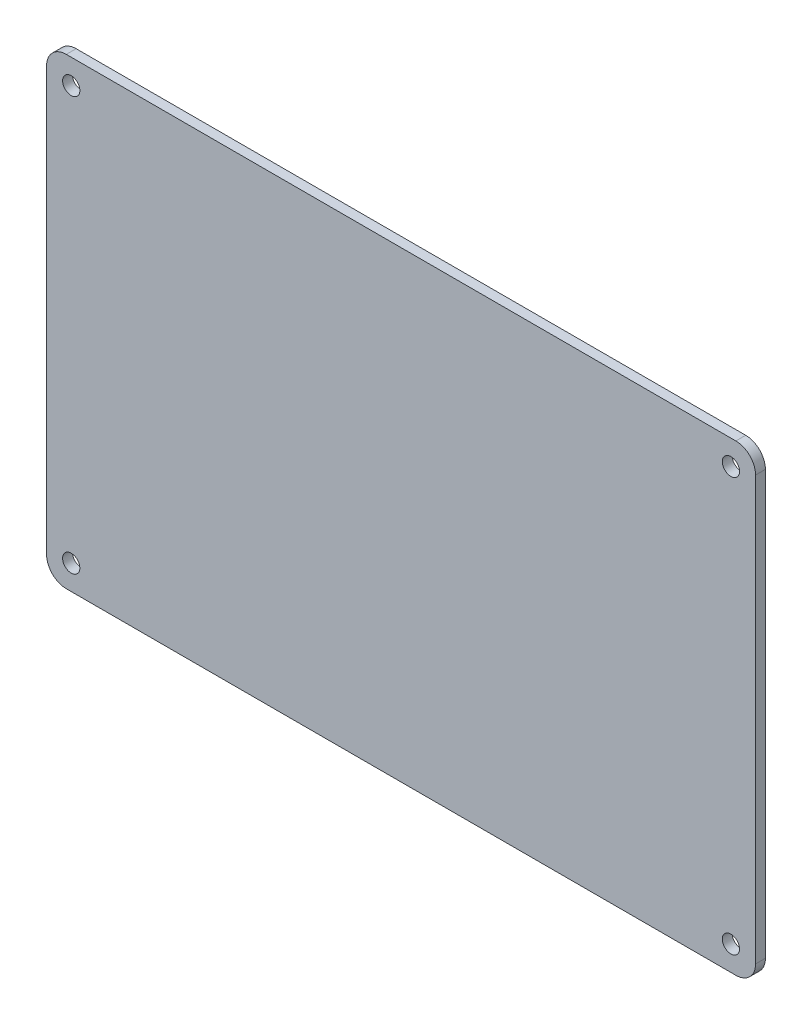
ISO-10303-21;
HEADER;
FILE_DESCRIPTION(('STEP AP214'),'2;1');
FILE_NAME('part.step','',(''),(''),'','','');
FILE_SCHEMA(('AUTOMOTIVE_DESIGN { 1 0 10303 214 1 1 1 1 }'));
ENDSEC;
DATA;
#1=APPLICATION_CONTEXT('core data for automotive mechanical design processes');
#2=APPLICATION_PROTOCOL_DEFINITION('international standard','automotive_design',2000,#1);
#3=PRODUCT_CONTEXT('',#1,'mechanical');
#4=PRODUCT('Part','Part','',(#3));
#5=PRODUCT_RELATED_PRODUCT_CATEGORY('part','',(#4));
#6=PRODUCT_DEFINITION_FORMATION('','',#4);
#7=PRODUCT_DEFINITION_CONTEXT('part definition',#1,'design');
#8=PRODUCT_DEFINITION('design','',#6,#7);
#9=PRODUCT_DEFINITION_SHAPE('','',#8);
#10=(LENGTH_UNIT() NAMED_UNIT(*) SI_UNIT(.MILLI.,.METRE.));
#11=(NAMED_UNIT(*) PLANE_ANGLE_UNIT() SI_UNIT($,.RADIAN.));
#12=(NAMED_UNIT(*) SI_UNIT($,.STERADIAN.) SOLID_ANGLE_UNIT());
#13=UNCERTAINTY_MEASURE_WITH_UNIT(LENGTH_MEASURE(1.E-05),#10,'distance_accuracy_value','');
#14=(GEOMETRIC_REPRESENTATION_CONTEXT(3) GLOBAL_UNCERTAINTY_ASSIGNED_CONTEXT((#13)) GLOBAL_UNIT_ASSIGNED_CONTEXT((#10,
#11,#12)) REPRESENTATION_CONTEXT('',''));
#15=CARTESIAN_POINT('',(0.,0.,0.));
#16=DIRECTION('',(0.,0.,1.));
#17=DIRECTION('',(1.,0.,0.));
#18=AXIS2_PLACEMENT_3D('',#15,#16,#17);
#19=CARTESIAN_POINT('',(68.,43.,2.));
#20=DIRECTION('',(0.,0.,-1.));
#21=DIRECTION('',(-1.,0.,0.));
#22=AXIS2_PLACEMENT_3D('',#19,#20,#21);
#23=PLANE('',#22);
#24=CARTESIAN_POINT('',(-67.,-42.,2.));
#25=DIRECTION('',(0.,0.,1.));
#26=DIRECTION('',(1.,0.,0.));
#27=AXIS2_PLACEMENT_3D('',#24,#25,#26);
#28=CIRCLE('',#27,1.75);
#29=CARTESIAN_POINT('',(-65.25,-42.,2.));
#30=VERTEX_POINT('',#29);
#31=EDGE_CURVE('E188',#30,#30,#28,.T.);
#32=ORIENTED_EDGE('',*,*,#31,.F.);
#33=EDGE_LOOP('',(#32));
#34=FACE_BOUND('',#33,.T.);
#35=CARTESIAN_POINT('',(-67.,42.,2.));
#36=DIRECTION('',(0.,0.,1.));
#37=DIRECTION('',(1.,0.,0.));
#38=AXIS2_PLACEMENT_3D('',#35,#36,#37);
#39=CIRCLE('',#38,1.75);
#40=CARTESIAN_POINT('',(-65.25,42.,2.));
#41=VERTEX_POINT('',#40);
#42=EDGE_CURVE('E134',#41,#41,#39,.T.);
#43=ORIENTED_EDGE('',*,*,#42,.F.);
#44=EDGE_LOOP('',(#43));
#45=FACE_BOUND('',#44,.T.);
#46=CARTESIAN_POINT('',(68.,43.,2.));
#47=DIRECTION('',(0.,0.,1.));
#48=DIRECTION('',(-1.,0.,0.));
#49=AXIS2_PLACEMENT_3D('',#46,#47,#48);
#50=CIRCLE('',#49,4.);
#51=CARTESIAN_POINT('',(72.,43.,2.));
#52=VERTEX_POINT('',#51);
#53=CARTESIAN_POINT('',(68.,47.,2.));
#54=VERTEX_POINT('',#53);
#55=EDGE_CURVE('E145',#52,#54,#50,.T.);
#56=ORIENTED_EDGE('',*,*,#55,.T.);
#57=DIRECTION('',(-1.,0.,0.));
#58=VECTOR('',#57,1.);
#59=CARTESIAN_POINT('',(-67.9999999999999,47.,2.));
#60=LINE('',#59,#58);
#61=CARTESIAN_POINT('',(-67.9999999999999,47.,2.));
#62=VERTEX_POINT('',#61);
#63=EDGE_CURVE('E93',#54,#62,#60,.T.);
#64=ORIENTED_EDGE('',*,*,#63,.T.);
#65=CARTESIAN_POINT('',(-68.,43.,2.));
#66=DIRECTION('',(0.,0.,1.));
#67=DIRECTION('',(-1.,0.,0.));
#68=AXIS2_PLACEMENT_3D('',#65,#66,#67);
#69=CIRCLE('',#68,4.);
#70=CARTESIAN_POINT('',(-72.,43.,2.));
#71=VERTEX_POINT('',#70);
#72=EDGE_CURVE('E160',#62,#71,#69,.T.);
#73=ORIENTED_EDGE('',*,*,#72,.T.);
#74=DIRECTION('',(0.,-1.,0.));
#75=VECTOR('',#74,1.);
#76=CARTESIAN_POINT('',(-72.,-43.,2.));
#77=LINE('',#76,#75);
#78=CARTESIAN_POINT('',(-72.,-43.,2.));
#79=VERTEX_POINT('',#78);
#80=EDGE_CURVE('E173',#71,#79,#77,.T.);
#81=ORIENTED_EDGE('',*,*,#80,.T.);
#82=CARTESIAN_POINT('',(-68.,-43.,2.));
#83=DIRECTION('',(0.,0.,1.));
#84=DIRECTION('',(-1.,0.,0.));
#85=AXIS2_PLACEMENT_3D('',#82,#83,#84);
#86=CIRCLE('',#85,4.);
#87=CARTESIAN_POINT('',(-67.9999999999999,-47.,2.));
#88=VERTEX_POINT('',#87);
#89=EDGE_CURVE('E112',#79,#88,#86,.T.);
#90=ORIENTED_EDGE('',*,*,#89,.T.);
#91=DIRECTION('',(1.,0.,0.));
#92=VECTOR('',#91,1.);
#93=CARTESIAN_POINT('',(-67.9999999999999,-47.,2.));
#94=LINE('',#93,#92);
#95=CARTESIAN_POINT('',(68.,-47.,2.));
#96=VERTEX_POINT('',#95);
#97=EDGE_CURVE('E106',#88,#96,#94,.T.);
#98=ORIENTED_EDGE('',*,*,#97,.T.);
#99=CARTESIAN_POINT('',(68.,-43.,2.));
#100=DIRECTION('',(0.,0.,1.));
#101=DIRECTION('',(1.,0.,0.));
#102=AXIS2_PLACEMENT_3D('',#99,#100,#101);
#103=CIRCLE('',#102,4.);
#104=CARTESIAN_POINT('',(72.,-43.,2.));
#105=VERTEX_POINT('',#104);
#106=EDGE_CURVE('E110',#96,#105,#103,.T.);
#107=ORIENTED_EDGE('',*,*,#106,.T.);
#108=DIRECTION('',(0.,1.,0.));
#109=VECTOR('',#108,1.);
#110=CARTESIAN_POINT('',(72.,-43.,2.));
#111=LINE('',#110,#109);
#112=EDGE_CURVE('E50',#105,#52,#111,.T.);
#113=ORIENTED_EDGE('',*,*,#112,.T.);
#114=EDGE_LOOP('',(#56,#64,#73,#81,#90,#98,#107,#113));
#115=FACE_BOUND('',#114,.T.);
#116=CARTESIAN_POINT('',(67.,42.,2.));
#117=DIRECTION('',(0.,0.,1.));
#118=DIRECTION('',(1.,0.,0.));
#119=AXIS2_PLACEMENT_3D('',#116,#117,#118);
#120=CIRCLE('',#119,1.75);
#121=CARTESIAN_POINT('',(68.75,42.,2.));
#122=VERTEX_POINT('',#121);
#123=EDGE_CURVE('E182',#122,#122,#120,.T.);
#124=ORIENTED_EDGE('',*,*,#123,.F.);
#125=EDGE_LOOP('',(#124));
#126=FACE_BOUND('',#125,.T.);
#127=CARTESIAN_POINT('',(67.,-42.,2.));
#128=DIRECTION('',(0.,0.,1.));
#129=DIRECTION('',(1.,0.,0.));
#130=AXIS2_PLACEMENT_3D('',#127,#128,#129);
#131=CIRCLE('',#130,1.75);
#132=CARTESIAN_POINT('',(68.75,-42.,2.));
#133=VERTEX_POINT('',#132);
#134=EDGE_CURVE('E194',#133,#133,#131,.T.);
#135=ORIENTED_EDGE('',*,*,#134,.F.);
#136=EDGE_LOOP('',(#135));
#137=FACE_BOUND('',#136,.T.);
#138=ADVANCED_FACE('F33',(#34,#45,#115,#126,#137),#23,.F.);
#139=CARTESIAN_POINT('',(68.,43.,0.));
#140=DIRECTION('',(0.,0.,-1.));
#141=DIRECTION('',(-1.,0.,0.));
#142=AXIS2_PLACEMENT_3D('',#139,#140,#141);
#143=PLANE('',#142);
#144=CARTESIAN_POINT('',(-67.,-42.,0.));
#145=DIRECTION('',(0.,0.,1.));
#146=DIRECTION('',(1.,0.,0.));
#147=AXIS2_PLACEMENT_3D('',#144,#145,#146);
#148=CIRCLE('',#147,1.75);
#149=CARTESIAN_POINT('',(-65.25,-42.,0.));
#150=VERTEX_POINT('',#149);
#151=EDGE_CURVE('E191',#150,#150,#148,.T.);
#152=ORIENTED_EDGE('',*,*,#151,.T.);
#153=EDGE_LOOP('',(#152));
#154=FACE_BOUND('',#153,.T.);
#155=CARTESIAN_POINT('',(-67.,42.,0.));
#156=DIRECTION('',(0.,0.,1.));
#157=DIRECTION('',(1.,0.,0.));
#158=AXIS2_PLACEMENT_3D('',#155,#156,#157);
#159=CIRCLE('',#158,1.75);
#160=CARTESIAN_POINT('',(-65.25,42.,0.));
#161=VERTEX_POINT('',#160);
#162=EDGE_CURVE('E179',#161,#161,#159,.T.);
#163=ORIENTED_EDGE('',*,*,#162,.T.);
#164=EDGE_LOOP('',(#163));
#165=FACE_BOUND('',#164,.T.);
#166=CARTESIAN_POINT('',(68.,43.,0.));
#167=DIRECTION('',(0.,0.,1.));
#168=DIRECTION('',(-1.,0.,0.));
#169=AXIS2_PLACEMENT_3D('',#166,#167,#168);
#170=CIRCLE('',#169,4.);
#171=CARTESIAN_POINT('',(72.,43.,0.));
#172=VERTEX_POINT('',#171);
#173=CARTESIAN_POINT('',(68.,47.,0.));
#174=VERTEX_POINT('',#173);
#175=EDGE_CURVE('E130',#172,#174,#170,.T.);
#176=ORIENTED_EDGE('',*,*,#175,.F.);
#177=DIRECTION('',(0.,1.,0.));
#178=VECTOR('',#177,1.);
#179=CARTESIAN_POINT('',(72.,-43.,0.));
#180=LINE('',#179,#178);
#181=CARTESIAN_POINT('',(72.,-43.,0.));
#182=VERTEX_POINT('',#181);
#183=EDGE_CURVE('E85',#182,#172,#180,.T.);
#184=ORIENTED_EDGE('',*,*,#183,.F.);
#185=CARTESIAN_POINT('',(68.,-43.,0.));
#186=DIRECTION('',(0.,0.,1.));
#187=DIRECTION('',(1.,0.,0.));
#188=AXIS2_PLACEMENT_3D('',#185,#186,#187);
#189=CIRCLE('',#188,4.);
#190=CARTESIAN_POINT('',(68.,-47.,0.));
#191=VERTEX_POINT('',#190);
#192=EDGE_CURVE('E79',#191,#182,#189,.T.);
#193=ORIENTED_EDGE('',*,*,#192,.F.);
#194=DIRECTION('',(1.,0.,0.));
#195=VECTOR('',#194,1.);
#196=CARTESIAN_POINT('',(-67.9999999999999,-47.,0.));
#197=LINE('',#196,#195);
#198=CARTESIAN_POINT('',(-67.9999999999999,-47.,0.));
#199=VERTEX_POINT('',#198);
#200=EDGE_CURVE('E120',#199,#191,#197,.T.);
#201=ORIENTED_EDGE('',*,*,#200,.F.);
#202=CARTESIAN_POINT('',(-68.,-43.,0.));
#203=DIRECTION('',(0.,0.,1.));
#204=DIRECTION('',(-1.,0.,0.));
#205=AXIS2_PLACEMENT_3D('',#202,#203,#204);
#206=CIRCLE('',#205,4.);
#207=CARTESIAN_POINT('',(-72.,-43.,0.));
#208=VERTEX_POINT('',#207);
#209=EDGE_CURVE('E140',#208,#199,#206,.T.);
#210=ORIENTED_EDGE('',*,*,#209,.F.);
#211=DIRECTION('',(0.,-1.,0.));
#212=VECTOR('',#211,1.);
#213=CARTESIAN_POINT('',(-72.,-43.,0.));
#214=LINE('',#213,#212);
#215=CARTESIAN_POINT('',(-72.,43.,0.));
#216=VERTEX_POINT('',#215);
#217=EDGE_CURVE('E138',#216,#208,#214,.T.);
#218=ORIENTED_EDGE('',*,*,#217,.F.);
#219=CARTESIAN_POINT('',(-68.,43.,0.));
#220=DIRECTION('',(0.,0.,1.));
#221=DIRECTION('',(-1.,0.,0.));
#222=AXIS2_PLACEMENT_3D('',#219,#220,#221);
#223=CIRCLE('',#222,4.);
#224=CARTESIAN_POINT('',(-67.9999999999999,47.,0.));
#225=VERTEX_POINT('',#224);
#226=EDGE_CURVE('E136',#225,#216,#223,.T.);
#227=ORIENTED_EDGE('',*,*,#226,.F.);
#228=DIRECTION('',(-1.,0.,0.));
#229=VECTOR('',#228,1.);
#230=CARTESIAN_POINT('',(-67.9999999999999,47.,0.));
#231=LINE('',#230,#229);
#232=EDGE_CURVE('E133',#174,#225,#231,.T.);
#233=ORIENTED_EDGE('',*,*,#232,.F.);
#234=EDGE_LOOP('',(#176,#184,#193,#201,#210,#218,#227,#233));
#235=FACE_BOUND('',#234,.T.);
#236=CARTESIAN_POINT('',(67.,42.,0.));
#237=DIRECTION('',(0.,0.,1.));
#238=DIRECTION('',(1.,0.,0.));
#239=AXIS2_PLACEMENT_3D('',#236,#237,#238);
#240=CIRCLE('',#239,1.75);
#241=CARTESIAN_POINT('',(68.75,42.,0.));
#242=VERTEX_POINT('',#241);
#243=EDGE_CURVE('E185',#242,#242,#240,.T.);
#244=ORIENTED_EDGE('',*,*,#243,.T.);
#245=EDGE_LOOP('',(#244));
#246=FACE_BOUND('',#245,.T.);
#247=CARTESIAN_POINT('',(67.,-42.,0.));
#248=DIRECTION('',(0.,0.,1.));
#249=DIRECTION('',(1.,0.,0.));
#250=AXIS2_PLACEMENT_3D('',#247,#248,#249);
#251=CIRCLE('',#250,1.75);
#252=CARTESIAN_POINT('',(68.75,-42.,0.));
#253=VERTEX_POINT('',#252);
#254=EDGE_CURVE('E197',#253,#253,#251,.T.);
#255=ORIENTED_EDGE('',*,*,#254,.T.);
#256=EDGE_LOOP('',(#255));
#257=FACE_BOUND('',#256,.T.);
#258=ADVANCED_FACE('F164',(#154,#165,#235,#246,#257),#143,.T.);
#259=CARTESIAN_POINT('',(68.,43.,2.));
#260=DIRECTION('',(0.,0.,-1.));
#261=DIRECTION('',(-1.,0.,0.));
#262=AXIS2_PLACEMENT_3D('',#259,#260,#261);
#263=CYLINDRICAL_SURFACE('',#262,4.);
#264=ORIENTED_EDGE('',*,*,#175,.T.);
#265=DIRECTION('',(0.,0.,-1.));
#266=VECTOR('',#265,1.);
#267=CARTESIAN_POINT('',(68.,47.,2.));
#268=LINE('',#267,#266);
#269=EDGE_CURVE('E11',#54,#174,#268,.T.);
#270=ORIENTED_EDGE('',*,*,#269,.F.);
#271=ORIENTED_EDGE('',*,*,#55,.F.);
#272=DIRECTION('',(0.,0.,-1.));
#273=VECTOR('',#272,1.);
#274=CARTESIAN_POINT('',(72.,43.,2.));
#275=LINE('',#274,#273);
#276=EDGE_CURVE('E126',#52,#172,#275,.T.);
#277=ORIENTED_EDGE('',*,*,#276,.T.);
#278=EDGE_LOOP('',(#264,#270,#271,#277));
#279=FACE_BOUND('',#278,.T.);
#280=ADVANCED_FACE('F35',(#279),#263,.T.);
#281=CARTESIAN_POINT('',(-67.9999999999999,47.,2.));
#282=DIRECTION('',(0.,-1.,0.));
#283=DIRECTION('',(0.,0.,-1.));
#284=AXIS2_PLACEMENT_3D('',#281,#282,#283);
#285=PLANE('',#284);
#286=ORIENTED_EDGE('',*,*,#232,.T.);
#287=DIRECTION('',(0.,0.,-1.));
#288=VECTOR('',#287,1.);
#289=CARTESIAN_POINT('',(-67.9999999999999,47.,2.));
#290=LINE('',#289,#288);
#291=EDGE_CURVE('E42',#62,#225,#290,.T.);
#292=ORIENTED_EDGE('',*,*,#291,.F.);
#293=ORIENTED_EDGE('',*,*,#63,.F.);
#294=ORIENTED_EDGE('',*,*,#269,.T.);
#295=EDGE_LOOP('',(#286,#292,#293,#294));
#296=FACE_BOUND('',#295,.T.);
#297=ADVANCED_FACE('F232',(#296),#285,.F.);
#298=CARTESIAN_POINT('',(-68.,43.,2.));
#299=DIRECTION('',(0.,0.,-1.));
#300=DIRECTION('',(-1.,0.,0.));
#301=AXIS2_PLACEMENT_3D('',#298,#299,#300);
#302=CYLINDRICAL_SURFACE('',#301,4.);
#303=ORIENTED_EDGE('',*,*,#226,.T.);
#304=DIRECTION('',(0.,0.,-1.));
#305=VECTOR('',#304,1.);
#306=CARTESIAN_POINT('',(-72.,43.,2.));
#307=LINE('',#306,#305);
#308=EDGE_CURVE('E152',#71,#216,#307,.T.);
#309=ORIENTED_EDGE('',*,*,#308,.F.);
#310=ORIENTED_EDGE('',*,*,#72,.F.);
#311=ORIENTED_EDGE('',*,*,#291,.T.);
#312=EDGE_LOOP('',(#303,#309,#310,#311));
#313=FACE_BOUND('',#312,.T.);
#314=ADVANCED_FACE('F158',(#313),#302,.T.);
#315=CARTESIAN_POINT('',(-72.,-43.,2.));
#316=DIRECTION('',(1.,0.,0.));
#317=DIRECTION('',(0.,0.,-1.));
#318=AXIS2_PLACEMENT_3D('',#315,#316,#317);
#319=PLANE('',#318);
#320=ORIENTED_EDGE('',*,*,#217,.T.);
#321=DIRECTION('',(0.,0.,-1.));
#322=VECTOR('',#321,1.);
#323=CARTESIAN_POINT('',(-72.,-43.,2.));
#324=LINE('',#323,#322);
#325=EDGE_CURVE('E149',#79,#208,#324,.T.);
#326=ORIENTED_EDGE('',*,*,#325,.F.);
#327=ORIENTED_EDGE('',*,*,#80,.F.);
#328=ORIENTED_EDGE('',*,*,#308,.T.);
#329=EDGE_LOOP('',(#320,#326,#327,#328));
#330=FACE_BOUND('',#329,.T.);
#331=ADVANCED_FACE('F169',(#330),#319,.F.);
#332=CARTESIAN_POINT('',(-68.,-43.,2.));
#333=DIRECTION('',(0.,0.,-1.));
#334=DIRECTION('',(-1.,0.,0.));
#335=AXIS2_PLACEMENT_3D('',#332,#333,#334);
#336=CYLINDRICAL_SURFACE('',#335,4.);
#337=ORIENTED_EDGE('',*,*,#209,.T.);
#338=DIRECTION('',(0.,0.,-1.));
#339=VECTOR('',#338,1.);
#340=CARTESIAN_POINT('',(-67.9999999999999,-47.,2.));
#341=LINE('',#340,#339);
#342=EDGE_CURVE('E121',#88,#199,#341,.T.);
#343=ORIENTED_EDGE('',*,*,#342,.F.);
#344=ORIENTED_EDGE('',*,*,#89,.F.);
#345=ORIENTED_EDGE('',*,*,#325,.T.);
#346=EDGE_LOOP('',(#337,#343,#344,#345));
#347=FACE_BOUND('',#346,.T.);
#348=ADVANCED_FACE('F172',(#347),#336,.T.);
#349=CARTESIAN_POINT('',(-67.9999999999999,-47.,2.));
#350=DIRECTION('',(0.,1.,0.));
#351=DIRECTION('',(0.,0.,1.));
#352=AXIS2_PLACEMENT_3D('',#349,#350,#351);
#353=PLANE('',#352);
#354=ORIENTED_EDGE('',*,*,#200,.T.);
#355=DIRECTION('',(0.,0.,-1.));
#356=VECTOR('',#355,1.);
#357=CARTESIAN_POINT('',(68.,-47.,2.));
#358=LINE('',#357,#356);
#359=EDGE_CURVE('E117',#96,#191,#358,.T.);
#360=ORIENTED_EDGE('',*,*,#359,.F.);
#361=ORIENTED_EDGE('',*,*,#97,.F.);
#362=ORIENTED_EDGE('',*,*,#342,.T.);
#363=EDGE_LOOP('',(#354,#360,#361,#362));
#364=FACE_BOUND('',#363,.T.);
#365=ADVANCED_FACE('F118',(#364),#353,.F.);
#366=CARTESIAN_POINT('',(68.,-43.,2.));
#367=DIRECTION('',(0.,0.,-1.));
#368=DIRECTION('',(-1.,0.,0.));
#369=AXIS2_PLACEMENT_3D('',#366,#367,#368);
#370=CYLINDRICAL_SURFACE('',#369,4.);
#371=ORIENTED_EDGE('',*,*,#192,.T.);
#372=DIRECTION('',(0.,0.,-1.));
#373=VECTOR('',#372,1.);
#374=CARTESIAN_POINT('',(72.,-43.,2.));
#375=LINE('',#374,#373);
#376=EDGE_CURVE('E122',#105,#182,#375,.T.);
#377=ORIENTED_EDGE('',*,*,#376,.F.);
#378=ORIENTED_EDGE('',*,*,#106,.F.);
#379=ORIENTED_EDGE('',*,*,#359,.T.);
#380=EDGE_LOOP('',(#371,#377,#378,#379));
#381=FACE_BOUND('',#380,.T.);
#382=ADVANCED_FACE('F124',(#381),#370,.T.);
#383=CARTESIAN_POINT('',(72.,-43.,2.));
#384=DIRECTION('',(-1.,0.,0.));
#385=DIRECTION('',(0.,0.,1.));
#386=AXIS2_PLACEMENT_3D('',#383,#384,#385);
#387=PLANE('',#386);
#388=ORIENTED_EDGE('',*,*,#183,.T.);
#389=ORIENTED_EDGE('',*,*,#276,.F.);
#390=ORIENTED_EDGE('',*,*,#112,.F.);
#391=ORIENTED_EDGE('',*,*,#376,.T.);
#392=EDGE_LOOP('',(#388,#389,#390,#391));
#393=FACE_BOUND('',#392,.T.);
#394=ADVANCED_FACE('F220',(#393),#387,.F.);
#395=CARTESIAN_POINT('',(-67.,42.,2.));
#396=DIRECTION('',(0.,0.,-1.));
#397=DIRECTION('',(-1.,0.,0.));
#398=AXIS2_PLACEMENT_3D('',#395,#396,#397);
#399=CYLINDRICAL_SURFACE('',#398,1.75);
#400=ORIENTED_EDGE('',*,*,#42,.T.);
#401=EDGE_LOOP('',(#400));
#402=FACE_BOUND('',#401,.T.);
#403=ORIENTED_EDGE('',*,*,#162,.F.);
#404=EDGE_LOOP('',(#403));
#405=FACE_BOUND('',#404,.T.);
#406=ADVANCED_FACE('F217',(#402,#405),#399,.F.);
#407=CARTESIAN_POINT('',(67.,42.,2.));
#408=DIRECTION('',(0.,0.,-1.));
#409=DIRECTION('',(-1.,0.,0.));
#410=AXIS2_PLACEMENT_3D('',#407,#408,#409);
#411=CYLINDRICAL_SURFACE('',#410,1.75);
#412=ORIENTED_EDGE('',*,*,#123,.T.);
#413=EDGE_LOOP('',(#412));
#414=FACE_BOUND('',#413,.T.);
#415=ORIENTED_EDGE('',*,*,#243,.F.);
#416=EDGE_LOOP('',(#415));
#417=FACE_BOUND('',#416,.T.);
#418=ADVANCED_FACE('F296',(#414,#417),#411,.F.);
#419=CARTESIAN_POINT('',(-67.,-42.,2.));
#420=DIRECTION('',(0.,0.,-1.));
#421=DIRECTION('',(-1.,0.,0.));
#422=AXIS2_PLACEMENT_3D('',#419,#420,#421);
#423=CYLINDRICAL_SURFACE('',#422,1.75);
#424=ORIENTED_EDGE('',*,*,#31,.T.);
#425=EDGE_LOOP('',(#424));
#426=FACE_BOUND('',#425,.T.);
#427=ORIENTED_EDGE('',*,*,#151,.F.);
#428=EDGE_LOOP('',(#427));
#429=FACE_BOUND('',#428,.T.);
#430=ADVANCED_FACE('F304',(#426,#429),#423,.F.);
#431=CARTESIAN_POINT('',(67.,-42.,2.));
#432=DIRECTION('',(0.,0.,-1.));
#433=DIRECTION('',(-1.,0.,0.));
#434=AXIS2_PLACEMENT_3D('',#431,#432,#433);
#435=CYLINDRICAL_SURFACE('',#434,1.75);
#436=ORIENTED_EDGE('',*,*,#134,.T.);
#437=EDGE_LOOP('',(#436));
#438=FACE_BOUND('',#437,.T.);
#439=ORIENTED_EDGE('',*,*,#254,.F.);
#440=EDGE_LOOP('',(#439));
#441=FACE_BOUND('',#440,.T.);
#442=ADVANCED_FACE('F203',(#438,#441),#435,.F.);
#443=CLOSED_SHELL('',(#138,#258,#280,#297,#314,#331,#348,#365,#382,#394,#406,#418,#430,#442));
#444=MANIFOLD_SOLID_BREP('B2',#443);
#445=ADVANCED_BREP_SHAPE_REPRESENTATION('',(#18,#444),#14);
#446=SHAPE_DEFINITION_REPRESENTATION(#9,#445);
ENDSEC;
END-ISO-10303-21;
